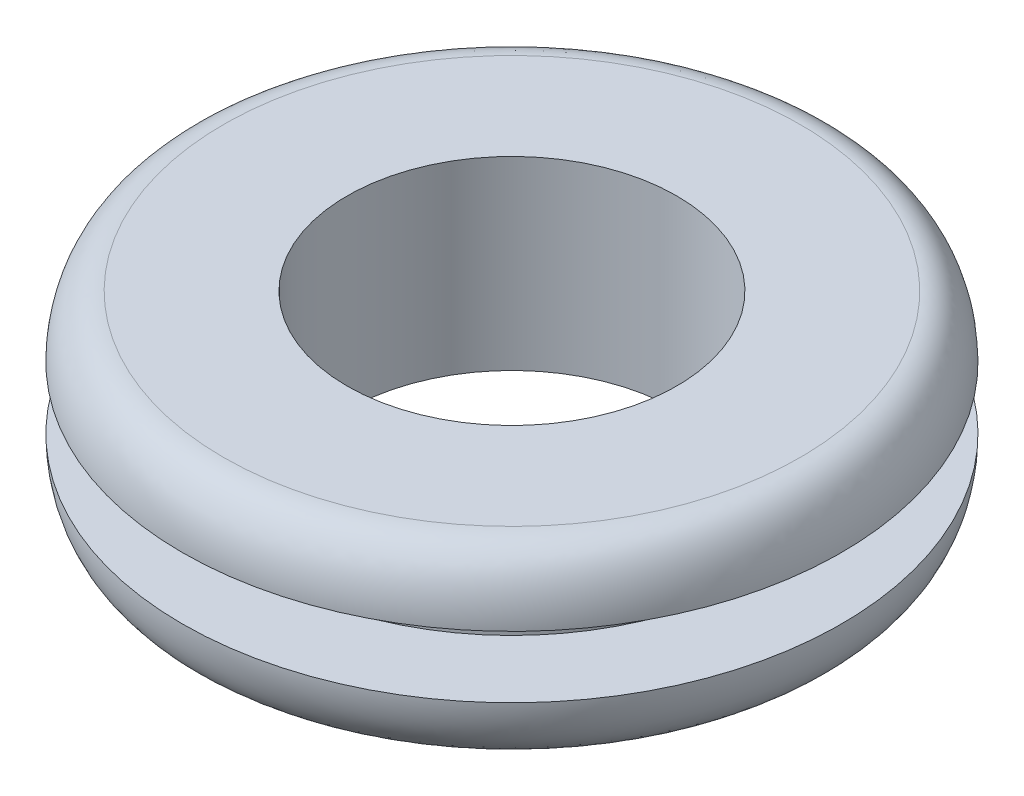
ISO-10303-21;
HEADER;
FILE_DESCRIPTION(('STEP AP214'),'2;1');
FILE_NAME('part.step','',(''),(''),'','','');
FILE_SCHEMA(('AUTOMOTIVE_DESIGN { 1 0 10303 214 1 1 1 1 }'));
ENDSEC;
DATA;
#1=APPLICATION_CONTEXT('core data for automotive mechanical design processes');
#2=APPLICATION_PROTOCOL_DEFINITION('international standard','automotive_design',2000,#1);
#3=PRODUCT_CONTEXT('',#1,'mechanical');
#4=PRODUCT('Part','Part','',(#3));
#5=PRODUCT_RELATED_PRODUCT_CATEGORY('part','',(#4));
#6=PRODUCT_DEFINITION_FORMATION('','',#4);
#7=PRODUCT_DEFINITION_CONTEXT('part definition',#1,'design');
#8=PRODUCT_DEFINITION('design','',#6,#7);
#9=PRODUCT_DEFINITION_SHAPE('','',#8);
#10=(LENGTH_UNIT() NAMED_UNIT(*) SI_UNIT(.MILLI.,.METRE.));
#11=(NAMED_UNIT(*) PLANE_ANGLE_UNIT() SI_UNIT($,.RADIAN.));
#12=(NAMED_UNIT(*) SI_UNIT($,.STERADIAN.) SOLID_ANGLE_UNIT());
#13=UNCERTAINTY_MEASURE_WITH_UNIT(LENGTH_MEASURE(1.E-05),#10,'distance_accuracy_value','');
#14=(GEOMETRIC_REPRESENTATION_CONTEXT(3) GLOBAL_UNCERTAINTY_ASSIGNED_CONTEXT((#13)) GLOBAL_UNIT_ASSIGNED_CONTEXT((#10,
#11,#12)) REPRESENTATION_CONTEXT('',''));
#15=CARTESIAN_POINT('',(0.,0.,0.));
#16=DIRECTION('',(0.,0.,1.));
#17=DIRECTION('',(1.,0.,0.));
#18=AXIS2_PLACEMENT_3D('',#15,#16,#17);
#19=CARTESIAN_POINT('',(-6.35,3.571875,0.));
#20=DIRECTION('',(0.,1.,0.));
#21=DIRECTION('',(0.,0.,1.));
#22=AXIS2_PLACEMENT_3D('',#19,#20,#21);
#23=PLANE('',#22);
#24=CARTESIAN_POINT('',(0.,3.571875,0.));
#25=DIRECTION('',(0.,1.,0.));
#26=DIRECTION('',(0.,0.,1.));
#27=AXIS2_PLACEMENT_3D('',#24,#25,#26);
#28=CIRCLE('',#27,11.1125);
#29=CARTESIAN_POINT('',(0.,3.571875,11.1125));
#30=VERTEX_POINT('',#29);
#31=EDGE_CURVE('E63',#30,#30,#28,.T.);
#32=ORIENTED_EDGE('',*,*,#31,.T.);
#33=EDGE_LOOP('',(#32));
#34=FACE_BOUND('',#33,.T.);
#35=CARTESIAN_POINT('',(0.,3.571875,0.));
#36=DIRECTION('',(0.,1.,0.));
#37=DIRECTION('',(0.,0.,1.));
#38=AXIS2_PLACEMENT_3D('',#35,#36,#37);
#39=CIRCLE('',#38,6.35);
#40=CARTESIAN_POINT('',(0.,3.571875,6.35));
#41=VERTEX_POINT('',#40);
#42=EDGE_CURVE('E10',#41,#41,#39,.T.);
#43=ORIENTED_EDGE('',*,*,#42,.F.);
#44=EDGE_LOOP('',(#43));
#45=FACE_BOUND('',#44,.T.);
#46=ADVANCED_FACE('F35',(#34,#45),#23,.T.);
#47=CARTESIAN_POINT('',(0.,96.2646314073627,0.));
#48=DIRECTION('',(0.,1.,0.));
#49=DIRECTION('',(0.,0.,1.));
#50=AXIS2_PLACEMENT_3D('',#47,#48,#49);
#51=CYLINDRICAL_SURFACE('',#50,6.35);
#52=ORIENTED_EDGE('',*,*,#42,.T.);
#53=EDGE_LOOP('',(#52));
#54=FACE_BOUND('',#53,.T.);
#55=CARTESIAN_POINT('',(0.,-3.571875,0.));
#56=DIRECTION('',(0.,1.,0.));
#57=DIRECTION('',(0.,0.,1.));
#58=AXIS2_PLACEMENT_3D('',#55,#56,#57);
#59=CIRCLE('',#58,6.35);
#60=CARTESIAN_POINT('',(0.,-3.571875,6.35));
#61=VERTEX_POINT('',#60);
#62=EDGE_CURVE('E41',#61,#61,#59,.T.);
#63=ORIENTED_EDGE('',*,*,#62,.F.);
#64=EDGE_LOOP('',(#63));
#65=FACE_BOUND('',#64,.T.);
#66=ADVANCED_FACE('F86',(#54,#65),#51,.F.);
#67=CARTESIAN_POINT('',(-6.35,-3.571875,0.));
#68=DIRECTION('',(0.,-1.,0.));
#69=DIRECTION('',(0.,0.,-1.));
#70=AXIS2_PLACEMENT_3D('',#67,#68,#69);
#71=PLANE('',#70);
#72=ORIENTED_EDGE('',*,*,#62,.T.);
#73=EDGE_LOOP('',(#72));
#74=FACE_BOUND('',#73,.T.);
#75=CARTESIAN_POINT('',(0.,-3.571875,0.));
#76=DIRECTION('',(0.,1.,0.));
#77=DIRECTION('',(0.,0.,1.));
#78=AXIS2_PLACEMENT_3D('',#75,#76,#77);
#79=CIRCLE('',#78,11.1125);
#80=CARTESIAN_POINT('',(0.,-3.571875,11.1125));
#81=VERTEX_POINT('',#80);
#82=EDGE_CURVE('E45',#81,#81,#79,.T.);
#83=ORIENTED_EDGE('',*,*,#82,.F.);
#84=EDGE_LOOP('',(#83));
#85=FACE_BOUND('',#84,.T.);
#86=ADVANCED_FACE('F82',(#74,#85),#71,.T.);
#87=CARTESIAN_POINT('',(-12.7,-1.190625,0.));
#88=CARTESIAN_POINT('',(-12.7,-2.22970733076051,0.));
#89=CARTESIAN_POINT('',(-12.2582657459829,-3.571875,0.));
#90=CARTESIAN_POINT('',(-11.1125,-3.571875,0.));
#91=B_SPLINE_CURVE_WITH_KNOTS('',3,(#87,#88,#89,#90),.UNSPECIFIED.,.F.,.F.,(4,4),(0.,1.),.UNSPECIFIED.);
#92=CARTESIAN_POINT('',(0.,96.2646314073627,0.));
#93=DIRECTION('',(0.,1.,0.));
#94=AXIS1_PLACEMENT('',#92,#93);
#95=SURFACE_OF_REVOLUTION('',#91,#94);
#96=ORIENTED_EDGE('',*,*,#82,.T.);
#97=EDGE_LOOP('',(#96));
#98=FACE_BOUND('',#97,.T.);
#99=CARTESIAN_POINT('',(0.,-1.190625,0.));
#100=DIRECTION('',(0.,1.,0.));
#101=DIRECTION('',(0.,0.,1.));
#102=AXIS2_PLACEMENT_3D('',#99,#100,#101);
#103=CIRCLE('',#102,12.7);
#104=CARTESIAN_POINT('',(0.,-1.190625,12.7));
#105=VERTEX_POINT('',#104);
#106=EDGE_CURVE('E49',#105,#105,#103,.T.);
#107=ORIENTED_EDGE('',*,*,#106,.F.);
#108=EDGE_LOOP('',(#107));
#109=FACE_BOUND('',#108,.T.);
#110=ADVANCED_FACE('F77',(#98,#109),#95,.F.);
#111=CARTESIAN_POINT('',(-12.7,-1.190625,0.));
#112=DIRECTION('',(0.,1.,0.));
#113=DIRECTION('',(0.,0.,1.));
#114=AXIS2_PLACEMENT_3D('',#111,#112,#113);
#115=PLANE('',#114);
#116=ORIENTED_EDGE('',*,*,#106,.T.);
#117=EDGE_LOOP('',(#116));
#118=FACE_BOUND('',#117,.T.);
#119=CARTESIAN_POINT('',(0.,-1.190625,0.));
#120=DIRECTION('',(0.,1.,0.));
#121=DIRECTION('',(0.,0.,1.));
#122=AXIS2_PLACEMENT_3D('',#119,#120,#121);
#123=CIRCLE('',#122,9.525);
#124=CARTESIAN_POINT('',(0.,-1.190625,9.525));
#125=VERTEX_POINT('',#124);
#126=EDGE_CURVE('E54',#125,#125,#123,.T.);
#127=ORIENTED_EDGE('',*,*,#126,.F.);
#128=EDGE_LOOP('',(#127));
#129=FACE_BOUND('',#128,.T.);
#130=ADVANCED_FACE('F81',(#118,#129),#115,.T.);
#131=CARTESIAN_POINT('',(0.,96.2646314073627,0.));
#132=DIRECTION('',(0.,1.,0.));
#133=DIRECTION('',(0.,0.,1.));
#134=AXIS2_PLACEMENT_3D('',#131,#132,#133);
#135=CYLINDRICAL_SURFACE('',#134,9.525);
#136=ORIENTED_EDGE('',*,*,#126,.T.);
#137=EDGE_LOOP('',(#136));
#138=FACE_BOUND('',#137,.T.);
#139=CARTESIAN_POINT('',(0.,1.190625,0.));
#140=DIRECTION('',(0.,1.,0.));
#141=DIRECTION('',(0.,0.,1.));
#142=AXIS2_PLACEMENT_3D('',#139,#140,#141);
#143=CIRCLE('',#142,9.525);
#144=CARTESIAN_POINT('',(0.,1.190625,9.525));
#145=VERTEX_POINT('',#144);
#146=EDGE_CURVE('E57',#145,#145,#143,.T.);
#147=ORIENTED_EDGE('',*,*,#146,.F.);
#148=EDGE_LOOP('',(#147));
#149=FACE_BOUND('',#148,.T.);
#150=ADVANCED_FACE('F106',(#138,#149),#135,.T.);
#151=CARTESIAN_POINT('',(-12.7,1.190625,0.));
#152=DIRECTION('',(0.,-1.,0.));
#153=DIRECTION('',(0.,0.,-1.));
#154=AXIS2_PLACEMENT_3D('',#151,#152,#153);
#155=PLANE('',#154);
#156=ORIENTED_EDGE('',*,*,#146,.T.);
#157=EDGE_LOOP('',(#156));
#158=FACE_BOUND('',#157,.T.);
#159=CARTESIAN_POINT('',(0.,1.190625,0.));
#160=DIRECTION('',(0.,1.,0.));
#161=DIRECTION('',(0.,0.,1.));
#162=AXIS2_PLACEMENT_3D('',#159,#160,#161);
#163=CIRCLE('',#162,12.7);
#164=CARTESIAN_POINT('',(0.,1.190625,12.7));
#165=VERTEX_POINT('',#164);
#166=EDGE_CURVE('E60',#165,#165,#163,.T.);
#167=ORIENTED_EDGE('',*,*,#166,.F.);
#168=EDGE_LOOP('',(#167));
#169=FACE_BOUND('',#168,.T.);
#170=ADVANCED_FACE('F100',(#158,#169),#155,.T.);
#171=CARTESIAN_POINT('',(-11.1125,3.571875,0.));
#172=CARTESIAN_POINT('',(-12.2582657459829,3.571875,0.));
#173=CARTESIAN_POINT('',(-12.7,2.22970733076051,0.));
#174=CARTESIAN_POINT('',(-12.7,1.190625,0.));
#175=B_SPLINE_CURVE_WITH_KNOTS('',3,(#171,#172,#173,#174),.UNSPECIFIED.,.F.,.F.,(4,4),(0.,1.),.UNSPECIFIED.);
#176=CARTESIAN_POINT('',(0.,96.2646314073627,0.));
#177=DIRECTION('',(0.,1.,0.));
#178=AXIS1_PLACEMENT('',#176,#177);
#179=SURFACE_OF_REVOLUTION('',#175,#178);
#180=ORIENTED_EDGE('',*,*,#166,.T.);
#181=EDGE_LOOP('',(#180));
#182=FACE_BOUND('',#181,.T.);
#183=ORIENTED_EDGE('',*,*,#31,.F.);
#184=EDGE_LOOP('',(#183));
#185=FACE_BOUND('',#184,.T.);
#186=ADVANCED_FACE('F98',(#182,#185),#179,.F.);
#187=CLOSED_SHELL('',(#46,#66,#86,#110,#130,#150,#170,#186));
#188=MANIFOLD_SOLID_BREP('B2',#187);
#189=ADVANCED_BREP_SHAPE_REPRESENTATION('',(#18,#188),#14);
#190=SHAPE_DEFINITION_REPRESENTATION(#9,#189);
ENDSEC;
END-ISO-10303-21;
